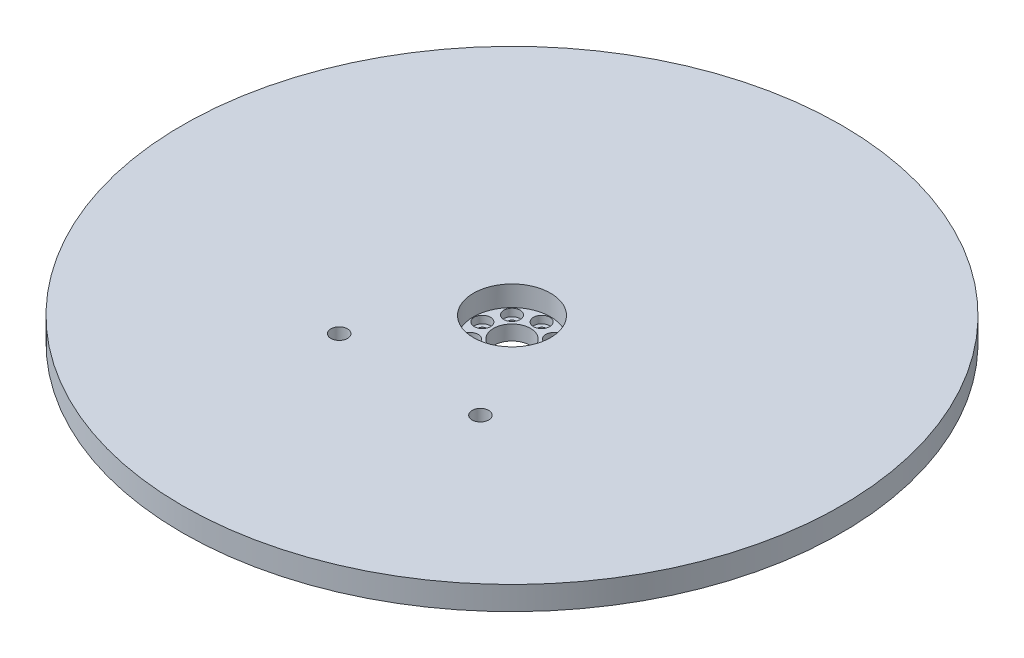
ISO-10303-21;
HEADER;
FILE_DESCRIPTION(('STEP AP214'),'2;1');
FILE_NAME('part.step','',(''),(''),'','','');
FILE_SCHEMA(('AUTOMOTIVE_DESIGN { 1 0 10303 214 1 1 1 1 }'));
ENDSEC;
DATA;
#1=APPLICATION_CONTEXT('core data for automotive mechanical design processes');
#2=APPLICATION_PROTOCOL_DEFINITION('international standard','automotive_design',2000,#1);
#3=PRODUCT_CONTEXT('',#1,'mechanical');
#4=PRODUCT('Part','Part','',(#3));
#5=PRODUCT_RELATED_PRODUCT_CATEGORY('part','',(#4));
#6=PRODUCT_DEFINITION_FORMATION('','',#4);
#7=PRODUCT_DEFINITION_CONTEXT('part definition',#1,'design');
#8=PRODUCT_DEFINITION('design','',#6,#7);
#9=PRODUCT_DEFINITION_SHAPE('','',#8);
#10=(LENGTH_UNIT() NAMED_UNIT(*) SI_UNIT(.MILLI.,.METRE.));
#11=(NAMED_UNIT(*) PLANE_ANGLE_UNIT() SI_UNIT($,.RADIAN.));
#12=(NAMED_UNIT(*) SI_UNIT($,.STERADIAN.) SOLID_ANGLE_UNIT());
#13=UNCERTAINTY_MEASURE_WITH_UNIT(LENGTH_MEASURE(1.E-05),#10,'distance_accuracy_value','');
#14=(GEOMETRIC_REPRESENTATION_CONTEXT(3) GLOBAL_UNCERTAINTY_ASSIGNED_CONTEXT((#13)) GLOBAL_UNIT_ASSIGNED_CONTEXT((#10,
#11,#12)) REPRESENTATION_CONTEXT('',''));
#15=CARTESIAN_POINT('',(0.,0.,0.));
#16=DIRECTION('',(0.,0.,1.));
#17=DIRECTION('',(1.,0.,0.));
#18=AXIS2_PLACEMENT_3D('',#15,#16,#17);
#19=CARTESIAN_POINT('',(0.,-2.35,0.));
#20=DIRECTION('',(0.,-1.,0.));
#21=DIRECTION('',(0.,0.,-1.));
#22=AXIS2_PLACEMENT_3D('',#19,#20,#21);
#23=PLANE('',#22);
#24=CARTESIAN_POINT('',(-5.6568542495,-2.35,-5.6568542495));
#25=DIRECTION('',(0.,1.,0.));
#26=DIRECTION('',(0.,0.,1.));
#27=AXIS2_PLACEMENT_3D('',#24,#25,#26);
#28=CIRCLE('',#27,2.19999999999999);
#29=CARTESIAN_POINT('',(-5.6568542495,-2.35,-3.45685424950001));
#30=VERTEX_POINT('',#29);
#31=EDGE_CURVE('E97',#30,#30,#28,.T.);
#32=ORIENTED_EDGE('',*,*,#31,.F.);
#33=EDGE_LOOP('',(#32));
#34=FACE_BOUND('',#33,.T.);
#35=CARTESIAN_POINT('',(0.,-2.35,-8.));
#36=DIRECTION('',(0.,1.,0.));
#37=DIRECTION('',(0.,0.,1.));
#38=AXIS2_PLACEMENT_3D('',#35,#36,#37);
#39=CIRCLE('',#38,2.19999999999999);
#40=CARTESIAN_POINT('',(0.,-2.35,-5.80000000000001));
#41=VERTEX_POINT('',#40);
#42=EDGE_CURVE('E93',#41,#41,#39,.T.);
#43=ORIENTED_EDGE('',*,*,#42,.F.);
#44=EDGE_LOOP('',(#43));
#45=FACE_BOUND('',#44,.T.);
#46=CARTESIAN_POINT('',(5.6568542495,-2.35,-5.6568542495));
#47=DIRECTION('',(0.,1.,0.));
#48=DIRECTION('',(0.,0.,1.));
#49=AXIS2_PLACEMENT_3D('',#46,#47,#48);
#50=CIRCLE('',#49,2.19999999999999);
#51=CARTESIAN_POINT('',(5.6568542495,-2.35,-3.45685424950001));
#52=VERTEX_POINT('',#51);
#53=EDGE_CURVE('E89',#52,#52,#50,.T.);
#54=ORIENTED_EDGE('',*,*,#53,.F.);
#55=EDGE_LOOP('',(#54));
#56=FACE_BOUND('',#55,.T.);
#57=CARTESIAN_POINT('',(8.,-2.35,0.));
#58=DIRECTION('',(0.,1.,0.));
#59=DIRECTION('',(0.,0.,1.));
#60=AXIS2_PLACEMENT_3D('',#57,#58,#59);
#61=CIRCLE('',#60,2.19999999999999);
#62=CARTESIAN_POINT('',(8.,-2.35,2.19999999999999));
#63=VERTEX_POINT('',#62);
#64=EDGE_CURVE('E84',#63,#63,#61,.T.);
#65=ORIENTED_EDGE('',*,*,#64,.F.);
#66=EDGE_LOOP('',(#65));
#67=FACE_BOUND('',#66,.T.);
#68=CARTESIAN_POINT('',(5.6568542495,-2.35,5.6568542495));
#69=DIRECTION('',(0.,1.,0.));
#70=DIRECTION('',(0.,0.,1.));
#71=AXIS2_PLACEMENT_3D('',#68,#69,#70);
#72=CIRCLE('',#71,2.19999999999999);
#73=CARTESIAN_POINT('',(5.6568542495,-2.35,7.85685424949999));
#74=VERTEX_POINT('',#73);
#75=EDGE_CURVE('E79',#74,#74,#72,.T.);
#76=ORIENTED_EDGE('',*,*,#75,.F.);
#77=EDGE_LOOP('',(#76));
#78=FACE_BOUND('',#77,.T.);
#79=CARTESIAN_POINT('',(-5.6568542495,-2.35,5.6568542495));
#80=DIRECTION('',(0.,1.,0.));
#81=DIRECTION('',(0.,0.,1.));
#82=AXIS2_PLACEMENT_3D('',#79,#80,#81);
#83=CIRCLE('',#82,2.19999999999999);
#84=CARTESIAN_POINT('',(-5.6568542495,-2.35,7.85685424949999));
#85=VERTEX_POINT('',#84);
#86=EDGE_CURVE('E69',#85,#85,#83,.T.);
#87=ORIENTED_EDGE('',*,*,#86,.F.);
#88=EDGE_LOOP('',(#87));
#89=FACE_BOUND('',#88,.T.);
#90=CARTESIAN_POINT('',(-8.,-2.35,0.));
#91=DIRECTION('',(0.,1.,0.));
#92=DIRECTION('',(0.,0.,1.));
#93=AXIS2_PLACEMENT_3D('',#90,#91,#92);
#94=CIRCLE('',#93,2.19999999999999);
#95=CARTESIAN_POINT('',(-8.,-2.35,2.19999999999999));
#96=VERTEX_POINT('',#95);
#97=EDGE_CURVE('E64',#96,#96,#94,.T.);
#98=ORIENTED_EDGE('',*,*,#97,.F.);
#99=EDGE_LOOP('',(#98));
#100=FACE_BOUND('',#99,.T.);
#101=CARTESIAN_POINT('',(0.,-2.35,0.));
#102=DIRECTION('',(0.,1.,0.));
#103=DIRECTION('',(0.,0.,1.));
#104=AXIS2_PLACEMENT_3D('',#101,#102,#103);
#105=CIRCLE('',#104,5.);
#106=CARTESIAN_POINT('',(0.,-2.35,5.));
#107=VERTEX_POINT('',#106);
#108=EDGE_CURVE('E165',#107,#107,#105,.T.);
#109=ORIENTED_EDGE('',*,*,#108,.F.);
#110=EDGE_LOOP('',(#109));
#111=FACE_BOUND('',#110,.T.);
#112=CARTESIAN_POINT('',(0.,-2.35,0.));
#113=DIRECTION('',(0.,-1.,0.));
#114=DIRECTION('',(0.,0.,-1.));
#115=AXIS2_PLACEMENT_3D('',#112,#113,#114);
#116=CIRCLE('',#115,10.4);
#117=CARTESIAN_POINT('',(0.,-2.35,-10.4));
#118=VERTEX_POINT('',#117);
#119=EDGE_CURVE('E173',#118,#118,#116,.F.);
#120=ORIENTED_EDGE('',*,*,#119,.T.);
#121=EDGE_LOOP('',(#120));
#122=FACE_BOUND('',#121,.T.);
#123=CARTESIAN_POINT('',(0.,-2.35,8.));
#124=DIRECTION('',(0.,1.,0.));
#125=DIRECTION('',(0.,0.,1.));
#126=AXIS2_PLACEMENT_3D('',#123,#124,#125);
#127=CIRCLE('',#126,2.19999999999999);
#128=CARTESIAN_POINT('',(0.,-2.35,10.2));
#129=VERTEX_POINT('',#128);
#130=EDGE_CURVE('E74',#129,#129,#127,.T.);
#131=ORIENTED_EDGE('',*,*,#130,.F.);
#132=EDGE_LOOP('',(#131));
#133=FACE_BOUND('',#132,.T.);
#134=ADVANCED_FACE('F39',(#34,#45,#56,#67,#78,#89,#100,#111,#122,#133),#23,.F.);
#135=CARTESIAN_POINT('',(0.,3.175,0.));
#136=DIRECTION('',(0.,-1.,0.));
#137=DIRECTION('',(0.,0.,-1.));
#138=AXIS2_PLACEMENT_3D('',#135,#136,#137);
#139=CYLINDRICAL_SURFACE('',#138,88.9);
#140=CARTESIAN_POINT('',(0.,3.175,0.));
#141=DIRECTION('',(0.,1.,0.));
#142=DIRECTION('',(0.,0.,1.));
#143=AXIS2_PLACEMENT_3D('',#140,#141,#142);
#144=CIRCLE('',#143,88.9);
#145=CARTESIAN_POINT('',(0.,3.175,88.9));
#146=VERTEX_POINT('',#145);
#147=EDGE_CURVE('E47',#146,#146,#144,.T.);
#148=ORIENTED_EDGE('',*,*,#147,.F.);
#149=EDGE_LOOP('',(#148));
#150=FACE_BOUND('',#149,.T.);
#151=CARTESIAN_POINT('',(0.,-3.175,0.));
#152=DIRECTION('',(0.,1.,0.));
#153=DIRECTION('',(0.,0.,1.));
#154=AXIS2_PLACEMENT_3D('',#151,#152,#153);
#155=CIRCLE('',#154,88.9);
#156=CARTESIAN_POINT('',(0.,-3.175,88.9));
#157=VERTEX_POINT('',#156);
#158=EDGE_CURVE('E52',#157,#157,#155,.T.);
#159=ORIENTED_EDGE('',*,*,#158,.T.);
#160=EDGE_LOOP('',(#159));
#161=FACE_BOUND('',#160,.T.);
#162=ADVANCED_FACE('F41',(#150,#161),#139,.T.);
#163=CARTESIAN_POINT('',(0.,3.175,0.));
#164=DIRECTION('',(0.,1.,0.));
#165=DIRECTION('',(0.,0.,1.));
#166=AXIS2_PLACEMENT_3D('',#163,#164,#165);
#167=PLANE('',#166);
#168=CARTESIAN_POINT('',(19.0499999999564,3.175,27.5642423430902));
#169=DIRECTION('',(0.,1.,0.));
#170=DIRECTION('',(0.,0.,1.));
#171=AXIS2_PLACEMENT_3D('',#168,#169,#170);
#172=CIRCLE('',#171,2.24999999999999);
#173=CARTESIAN_POINT('',(19.0499999999564,3.175,29.8142423430901));
#174=VERTEX_POINT('',#173);
#175=EDGE_CURVE('E109',#174,#174,#172,.T.);
#176=ORIENTED_EDGE('',*,*,#175,.F.);
#177=EDGE_LOOP('',(#176));
#178=FACE_BOUND('',#177,.T.);
#179=CARTESIAN_POINT('',(-19.0500000000436,3.175,27.5642423430902));
#180=DIRECTION('',(0.,1.,0.));
#181=DIRECTION('',(0.,0.,1.));
#182=AXIS2_PLACEMENT_3D('',#179,#180,#181);
#183=CIRCLE('',#182,2.24999999999999);
#184=CARTESIAN_POINT('',(-19.0500000000436,3.175,29.8142423430901));
#185=VERTEX_POINT('',#184);
#186=EDGE_CURVE('E98',#185,#185,#183,.T.);
#187=ORIENTED_EDGE('',*,*,#186,.F.);
#188=EDGE_LOOP('',(#187));
#189=FACE_BOUND('',#188,.T.);
#190=CARTESIAN_POINT('',(0.,3.175,0.));
#191=DIRECTION('',(0.,1.,0.));
#192=DIRECTION('',(0.,0.,1.));
#193=AXIS2_PLACEMENT_3D('',#190,#191,#192);
#194=CIRCLE('',#193,10.4);
#195=CARTESIAN_POINT('',(0.,3.175,10.4));
#196=VERTEX_POINT('',#195);
#197=EDGE_CURVE('E168',#196,#196,#194,.T.);
#198=ORIENTED_EDGE('',*,*,#197,.F.);
#199=EDGE_LOOP('',(#198));
#200=FACE_BOUND('',#199,.T.);
#201=ORIENTED_EDGE('',*,*,#147,.T.);
#202=EDGE_LOOP('',(#201));
#203=FACE_BOUND('',#202,.T.);
#204=ADVANCED_FACE('F187',(#178,#189,#200,#203),#167,.T.);
#205=CARTESIAN_POINT('',(0.,-3.175,0.));
#206=DIRECTION('',(0.,1.,0.));
#207=DIRECTION('',(0.,0.,1.));
#208=AXIS2_PLACEMENT_3D('',#205,#206,#207);
#209=PLANE('',#208);
#210=CARTESIAN_POINT('',(19.0499999999564,-3.175,27.5642423430902));
#211=DIRECTION('',(0.,1.,0.));
#212=DIRECTION('',(0.,0.,1.));
#213=AXIS2_PLACEMENT_3D('',#210,#211,#212);
#214=CIRCLE('',#213,2.24999999999999);
#215=CARTESIAN_POINT('',(19.0499999999564,-3.175,29.8142423430901));
#216=VERTEX_POINT('',#215);
#217=EDGE_CURVE('E43',#216,#216,#214,.T.);
#218=ORIENTED_EDGE('',*,*,#217,.T.);
#219=EDGE_LOOP('',(#218));
#220=FACE_BOUND('',#219,.T.);
#221=CARTESIAN_POINT('',(-19.0500000000436,-3.175,27.5642423430902));
#222=DIRECTION('',(0.,1.,0.));
#223=DIRECTION('',(0.,0.,1.));
#224=AXIS2_PLACEMENT_3D('',#221,#222,#223);
#225=CIRCLE('',#224,2.24999999999999);
#226=CARTESIAN_POINT('',(-19.0500000000436,-3.175,29.8142423430901));
#227=VERTEX_POINT('',#226);
#228=EDGE_CURVE('E95',#227,#227,#225,.T.);
#229=ORIENTED_EDGE('',*,*,#228,.T.);
#230=EDGE_LOOP('',(#229));
#231=FACE_BOUND('',#230,.T.);
#232=CARTESIAN_POINT('',(0.,-3.175,0.));
#233=DIRECTION('',(0.,1.,0.));
#234=DIRECTION('',(0.,0.,1.));
#235=AXIS2_PLACEMENT_3D('',#232,#233,#234);
#236=CIRCLE('',#235,12.065);
#237=CARTESIAN_POINT('',(0.,-3.175,12.065));
#238=VERTEX_POINT('',#237);
#239=EDGE_CURVE('E11',#238,#238,#236,.F.);
#240=ORIENTED_EDGE('',*,*,#239,.F.);
#241=EDGE_LOOP('',(#240));
#242=FACE_BOUND('',#241,.T.);
#243=ORIENTED_EDGE('',*,*,#158,.F.);
#244=EDGE_LOOP('',(#243));
#245=FACE_BOUND('',#244,.T.);
#246=ADVANCED_FACE('F184',(#220,#231,#242,#245),#209,.F.);
#247=CARTESIAN_POINT('',(0.,-6.35,0.));
#248=DIRECTION('',(0.,1.,0.));
#249=DIRECTION('',(0.,0.,1.));
#250=AXIS2_PLACEMENT_3D('',#247,#248,#249);
#251=CYLINDRICAL_SURFACE('',#250,12.065);
#252=CARTESIAN_POINT('',(0.,-6.35,0.));
#253=DIRECTION('',(0.,-1.,0.));
#254=DIRECTION('',(0.,0.,-1.));
#255=AXIS2_PLACEMENT_3D('',#252,#253,#254);
#256=CIRCLE('',#255,12.065);
#257=CARTESIAN_POINT('',(0.,-6.35,-12.065));
#258=VERTEX_POINT('',#257);
#259=EDGE_CURVE('E176',#258,#258,#256,.T.);
#260=ORIENTED_EDGE('',*,*,#259,.F.);
#261=EDGE_LOOP('',(#260));
#262=FACE_BOUND('',#261,.T.);
#263=ORIENTED_EDGE('',*,*,#239,.T.);
#264=EDGE_LOOP('',(#263));
#265=FACE_BOUND('',#264,.T.);
#266=ADVANCED_FACE('F186',(#262,#265),#251,.T.);
#267=CARTESIAN_POINT('',(0.,-6.35,0.));
#268=DIRECTION('',(0.,-1.,0.));
#269=DIRECTION('',(0.,0.,-1.));
#270=AXIS2_PLACEMENT_3D('',#267,#268,#269);
#271=PLANE('',#270);
#272=CARTESIAN_POINT('',(-5.6568542495,-6.35,-5.6568542495));
#273=DIRECTION('',(0.,-1.,0.));
#274=DIRECTION('',(0.,0.,-1.));
#275=AXIS2_PLACEMENT_3D('',#272,#273,#274);
#276=CIRCLE('',#275,1.1);
#277=CARTESIAN_POINT('',(-5.6568542495,-6.35,-6.7568542495));
#278=VERTEX_POINT('',#277);
#279=EDGE_CURVE('E91',#278,#278,#276,.T.);
#280=ORIENTED_EDGE('',*,*,#279,.F.);
#281=EDGE_LOOP('',(#280));
#282=FACE_BOUND('',#281,.T.);
#283=CARTESIAN_POINT('',(0.,-6.35,-8.));
#284=DIRECTION('',(0.,-1.,0.));
#285=DIRECTION('',(0.,0.,-1.));
#286=AXIS2_PLACEMENT_3D('',#283,#284,#285);
#287=CIRCLE('',#286,1.1);
#288=CARTESIAN_POINT('',(0.,-6.35,-9.1));
#289=VERTEX_POINT('',#288);
#290=EDGE_CURVE('E86',#289,#289,#287,.T.);
#291=ORIENTED_EDGE('',*,*,#290,.F.);
#292=EDGE_LOOP('',(#291));
#293=FACE_BOUND('',#292,.T.);
#294=CARTESIAN_POINT('',(5.6568542495,-6.35,-5.6568542495));
#295=DIRECTION('',(0.,-1.,0.));
#296=DIRECTION('',(0.,0.,-1.));
#297=AXIS2_PLACEMENT_3D('',#294,#295,#296);
#298=CIRCLE('',#297,1.1);
#299=CARTESIAN_POINT('',(5.6568542495,-6.35,-6.7568542495));
#300=VERTEX_POINT('',#299);
#301=EDGE_CURVE('E81',#300,#300,#298,.T.);
#302=ORIENTED_EDGE('',*,*,#301,.F.);
#303=EDGE_LOOP('',(#302));
#304=FACE_BOUND('',#303,.T.);
#305=CARTESIAN_POINT('',(8.,-6.35,0.));
#306=DIRECTION('',(0.,-1.,0.));
#307=DIRECTION('',(0.,0.,-1.));
#308=AXIS2_PLACEMENT_3D('',#305,#306,#307);
#309=CIRCLE('',#308,1.1);
#310=CARTESIAN_POINT('',(8.,-6.35,-1.1));
#311=VERTEX_POINT('',#310);
#312=EDGE_CURVE('E76',#311,#311,#309,.T.);
#313=ORIENTED_EDGE('',*,*,#312,.F.);
#314=EDGE_LOOP('',(#313));
#315=FACE_BOUND('',#314,.T.);
#316=CARTESIAN_POINT('',(5.6568542495,-6.35,5.6568542495));
#317=DIRECTION('',(0.,-1.,0.));
#318=DIRECTION('',(0.,0.,-1.));
#319=AXIS2_PLACEMENT_3D('',#316,#317,#318);
#320=CIRCLE('',#319,1.1);
#321=CARTESIAN_POINT('',(5.6568542495,-6.35,4.5568542495));
#322=VERTEX_POINT('',#321);
#323=EDGE_CURVE('E71',#322,#322,#320,.T.);
#324=ORIENTED_EDGE('',*,*,#323,.F.);
#325=EDGE_LOOP('',(#324));
#326=FACE_BOUND('',#325,.T.);
#327=CARTESIAN_POINT('',(0.,-6.35,8.));
#328=DIRECTION('',(0.,-1.,0.));
#329=DIRECTION('',(0.,0.,-1.));
#330=AXIS2_PLACEMENT_3D('',#327,#328,#329);
#331=CIRCLE('',#330,1.1);
#332=CARTESIAN_POINT('',(0.,-6.35,6.9));
#333=VERTEX_POINT('',#332);
#334=EDGE_CURVE('E66',#333,#333,#331,.T.);
#335=ORIENTED_EDGE('',*,*,#334,.F.);
#336=EDGE_LOOP('',(#335));
#337=FACE_BOUND('',#336,.T.);
#338=CARTESIAN_POINT('',(-5.6568542495,-6.35,5.6568542495));
#339=DIRECTION('',(0.,-1.,0.));
#340=DIRECTION('',(0.,0.,-1.));
#341=AXIS2_PLACEMENT_3D('',#338,#339,#340);
#342=CIRCLE('',#341,1.1);
#343=CARTESIAN_POINT('',(-5.6568542495,-6.35,4.5568542495));
#344=VERTEX_POINT('',#343);
#345=EDGE_CURVE('E61',#344,#344,#342,.T.);
#346=ORIENTED_EDGE('',*,*,#345,.F.);
#347=EDGE_LOOP('',(#346));
#348=FACE_BOUND('',#347,.T.);
#349=CARTESIAN_POINT('',(-8.,-6.35,0.));
#350=DIRECTION('',(0.,-1.,0.));
#351=DIRECTION('',(0.,0.,-1.));
#352=AXIS2_PLACEMENT_3D('',#349,#350,#351);
#353=CIRCLE('',#352,1.1);
#354=CARTESIAN_POINT('',(-8.,-6.35,-1.1));
#355=VERTEX_POINT('',#354);
#356=EDGE_CURVE('E56',#355,#355,#353,.T.);
#357=ORIENTED_EDGE('',*,*,#356,.F.);
#358=EDGE_LOOP('',(#357));
#359=FACE_BOUND('',#358,.T.);
#360=CARTESIAN_POINT('',(0.,-6.35,0.));
#361=DIRECTION('',(0.,-1.,0.));
#362=DIRECTION('',(0.,0.,-1.));
#363=AXIS2_PLACEMENT_3D('',#360,#361,#362);
#364=CIRCLE('',#363,5.);
#365=CARTESIAN_POINT('',(0.,-6.35,-5.));
#366=VERTEX_POINT('',#365);
#367=EDGE_CURVE('E59',#366,#366,#364,.F.);
#368=ORIENTED_EDGE('',*,*,#367,.T.);
#369=EDGE_LOOP('',(#368));
#370=FACE_BOUND('',#369,.T.);
#371=ORIENTED_EDGE('',*,*,#259,.T.);
#372=EDGE_LOOP('',(#371));
#373=FACE_BOUND('',#372,.T.);
#374=ADVANCED_FACE('F193',(#282,#293,#304,#315,#326,#337,#348,#359,#370,#373),#271,.T.);
#375=CARTESIAN_POINT('',(0.,-35.7656420973604,0.));
#376=DIRECTION('',(0.,1.,0.));
#377=DIRECTION('',(0.,0.,1.));
#378=AXIS2_PLACEMENT_3D('',#375,#376,#377);
#379=CYLINDRICAL_SURFACE('',#378,10.4);
#380=ORIENTED_EDGE('',*,*,#197,.T.);
#381=EDGE_LOOP('',(#380));
#382=FACE_BOUND('',#381,.T.);
#383=ORIENTED_EDGE('',*,*,#119,.F.);
#384=EDGE_LOOP('',(#383));
#385=FACE_BOUND('',#384,.T.);
#386=ADVANCED_FACE('F209',(#382,#385),#379,.F.);
#387=CARTESIAN_POINT('',(0.,-6.351,0.));
#388=DIRECTION('',(0.,1.,0.));
#389=DIRECTION('',(0.,0.,1.));
#390=AXIS2_PLACEMENT_3D('',#387,#388,#389);
#391=CYLINDRICAL_SURFACE('',#390,5.);
#392=ORIENTED_EDGE('',*,*,#367,.F.);
#393=EDGE_LOOP('',(#392));
#394=FACE_BOUND('',#393,.T.);
#395=ORIENTED_EDGE('',*,*,#108,.T.);
#396=EDGE_LOOP('',(#395));
#397=FACE_BOUND('',#396,.T.);
#398=ADVANCED_FACE('F216',(#394,#397),#391,.F.);
#399=CARTESIAN_POINT('',(-8.,-2.35,0.));
#400=DIRECTION('',(0.,1.,0.));
#401=DIRECTION('',(0.,0.,1.));
#402=AXIS2_PLACEMENT_3D('',#399,#400,#401);
#403=CYLINDRICAL_SURFACE('',#402,1.1);
#404=ORIENTED_EDGE('',*,*,#356,.T.);
#405=EDGE_LOOP('',(#404));
#406=FACE_BOUND('',#405,.T.);
#407=CARTESIAN_POINT('',(-8.,-4.35,0.));
#408=DIRECTION('',(0.,1.,0.));
#409=DIRECTION('',(0.,0.,1.));
#410=AXIS2_PLACEMENT_3D('',#407,#408,#409);
#411=CIRCLE('',#410,1.1);
#412=CARTESIAN_POINT('',(-8.,-4.35,1.1));
#413=VERTEX_POINT('',#412);
#414=EDGE_CURVE('E60',#413,#413,#411,.T.);
#415=ORIENTED_EDGE('',*,*,#414,.T.);
#416=EDGE_LOOP('',(#415));
#417=FACE_BOUND('',#416,.T.);
#418=ADVANCED_FACE('F238',(#406,#417),#403,.F.);
#419=CARTESIAN_POINT('',(-6.9,-4.35,0.));
#420=DIRECTION('',(0.,-1.,0.));
#421=DIRECTION('',(0.,0.,-1.));
#422=AXIS2_PLACEMENT_3D('',#419,#420,#421);
#423=PLANE('',#422);
#424=ORIENTED_EDGE('',*,*,#414,.F.);
#425=EDGE_LOOP('',(#424));
#426=FACE_BOUND('',#425,.T.);
#427=CARTESIAN_POINT('',(-8.,-4.35,0.));
#428=DIRECTION('',(0.,1.,0.));
#429=DIRECTION('',(0.,0.,1.));
#430=AXIS2_PLACEMENT_3D('',#427,#428,#429);
#431=CIRCLE('',#430,2.2);
#432=CARTESIAN_POINT('',(-8.,-4.35,2.2));
#433=VERTEX_POINT('',#432);
#434=EDGE_CURVE('E160',#433,#433,#431,.T.);
#435=ORIENTED_EDGE('',*,*,#434,.T.);
#436=EDGE_LOOP('',(#435));
#437=FACE_BOUND('',#436,.T.);
#438=ADVANCED_FACE('F283',(#426,#437),#423,.F.);
#439=CARTESIAN_POINT('',(-8.,-2.35,0.));
#440=DIRECTION('',(0.,1.,0.));
#441=DIRECTION('',(0.,0.,1.));
#442=AXIS2_PLACEMENT_3D('',#439,#440,#441);
#443=CYLINDRICAL_SURFACE('',#442,2.19999999999999);
#444=ORIENTED_EDGE('',*,*,#434,.F.);
#445=EDGE_LOOP('',(#444));
#446=FACE_BOUND('',#445,.T.);
#447=ORIENTED_EDGE('',*,*,#97,.T.);
#448=EDGE_LOOP('',(#447));
#449=FACE_BOUND('',#448,.T.);
#450=ADVANCED_FACE('F279',(#446,#449),#443,.F.);
#451=CARTESIAN_POINT('',(-5.6568542495,-2.35,5.6568542495));
#452=DIRECTION('',(0.,1.,0.));
#453=DIRECTION('',(0.,0.,1.));
#454=AXIS2_PLACEMENT_3D('',#451,#452,#453);
#455=CYLINDRICAL_SURFACE('',#454,1.1);
#456=ORIENTED_EDGE('',*,*,#345,.T.);
#457=EDGE_LOOP('',(#456));
#458=FACE_BOUND('',#457,.T.);
#459=CARTESIAN_POINT('',(-5.6568542495,-4.35,5.6568542495));
#460=DIRECTION('',(0.,1.,0.));
#461=DIRECTION('',(0.,0.,1.));
#462=AXIS2_PLACEMENT_3D('',#459,#460,#461);
#463=CIRCLE('',#462,1.1);
#464=CARTESIAN_POINT('',(-5.6568542495,-4.35,6.7568542495));
#465=VERTEX_POINT('',#464);
#466=EDGE_CURVE('E65',#465,#465,#463,.T.);
#467=ORIENTED_EDGE('',*,*,#466,.T.);
#468=EDGE_LOOP('',(#467));
#469=FACE_BOUND('',#468,.T.);
#470=ADVANCED_FACE('F275',(#458,#469),#455,.F.);
#471=CARTESIAN_POINT('',(-4.5568542495,-4.35,5.6568542495));
#472=DIRECTION('',(0.,-1.,0.));
#473=DIRECTION('',(0.,0.,-1.));
#474=AXIS2_PLACEMENT_3D('',#471,#472,#473);
#475=PLANE('',#474);
#476=ORIENTED_EDGE('',*,*,#466,.F.);
#477=EDGE_LOOP('',(#476));
#478=FACE_BOUND('',#477,.T.);
#479=CARTESIAN_POINT('',(-5.6568542495,-4.35,5.6568542495));
#480=DIRECTION('',(0.,1.,0.));
#481=DIRECTION('',(0.,0.,1.));
#482=AXIS2_PLACEMENT_3D('',#479,#480,#481);
#483=CIRCLE('',#482,2.2);
#484=CARTESIAN_POINT('',(-5.6568542495,-4.35,7.8568542495));
#485=VERTEX_POINT('',#484);
#486=EDGE_CURVE('E153',#485,#485,#483,.T.);
#487=ORIENTED_EDGE('',*,*,#486,.T.);
#488=EDGE_LOOP('',(#487));
#489=FACE_BOUND('',#488,.T.);
#490=ADVANCED_FACE('F271',(#478,#489),#475,.F.);
#491=CARTESIAN_POINT('',(-5.6568542495,-2.35,5.6568542495));
#492=DIRECTION('',(0.,1.,0.));
#493=DIRECTION('',(0.,0.,1.));
#494=AXIS2_PLACEMENT_3D('',#491,#492,#493);
#495=CYLINDRICAL_SURFACE('',#494,2.19999999999999);
#496=ORIENTED_EDGE('',*,*,#486,.F.);
#497=EDGE_LOOP('',(#496));
#498=FACE_BOUND('',#497,.T.);
#499=ORIENTED_EDGE('',*,*,#86,.T.);
#500=EDGE_LOOP('',(#499));
#501=FACE_BOUND('',#500,.T.);
#502=ADVANCED_FACE('F267',(#498,#501),#495,.F.);
#503=CARTESIAN_POINT('',(0.,-2.35,8.));
#504=DIRECTION('',(0.,1.,0.));
#505=DIRECTION('',(0.,0.,1.));
#506=AXIS2_PLACEMENT_3D('',#503,#504,#505);
#507=CYLINDRICAL_SURFACE('',#506,1.1);
#508=ORIENTED_EDGE('',*,*,#334,.T.);
#509=EDGE_LOOP('',(#508));
#510=FACE_BOUND('',#509,.T.);
#511=CARTESIAN_POINT('',(0.,-4.35,8.));
#512=DIRECTION('',(0.,1.,0.));
#513=DIRECTION('',(0.,0.,1.));
#514=AXIS2_PLACEMENT_3D('',#511,#512,#513);
#515=CIRCLE('',#514,1.1);
#516=CARTESIAN_POINT('',(0.,-4.35,9.1));
#517=VERTEX_POINT('',#516);
#518=EDGE_CURVE('E70',#517,#517,#515,.T.);
#519=ORIENTED_EDGE('',*,*,#518,.T.);
#520=EDGE_LOOP('',(#519));
#521=FACE_BOUND('',#520,.T.);
#522=ADVANCED_FACE('F259',(#510,#521),#507,.F.);
#523=CARTESIAN_POINT('',(1.1,-4.35,8.));
#524=DIRECTION('',(0.,-1.,0.));
#525=DIRECTION('',(0.,0.,-1.));
#526=AXIS2_PLACEMENT_3D('',#523,#524,#525);
#527=PLANE('',#526);
#528=ORIENTED_EDGE('',*,*,#518,.F.);
#529=EDGE_LOOP('',(#528));
#530=FACE_BOUND('',#529,.T.);
#531=CARTESIAN_POINT('',(0.,-4.35,8.));
#532=DIRECTION('',(0.,1.,0.));
#533=DIRECTION('',(0.,0.,1.));
#534=AXIS2_PLACEMENT_3D('',#531,#532,#533);
#535=CIRCLE('',#534,2.2);
#536=CARTESIAN_POINT('',(0.,-4.35,10.2));
#537=VERTEX_POINT('',#536);
#538=EDGE_CURVE('E146',#537,#537,#535,.T.);
#539=ORIENTED_EDGE('',*,*,#538,.T.);
#540=EDGE_LOOP('',(#539));
#541=FACE_BOUND('',#540,.T.);
#542=ADVANCED_FACE('F249',(#530,#541),#527,.F.);
#543=CARTESIAN_POINT('',(0.,-2.35,8.));
#544=DIRECTION('',(0.,1.,0.));
#545=DIRECTION('',(0.,0.,1.));
#546=AXIS2_PLACEMENT_3D('',#543,#544,#545);
#547=CYLINDRICAL_SURFACE('',#546,2.19999999999999);
#548=ORIENTED_EDGE('',*,*,#538,.F.);
#549=EDGE_LOOP('',(#548));
#550=FACE_BOUND('',#549,.T.);
#551=ORIENTED_EDGE('',*,*,#130,.T.);
#552=EDGE_LOOP('',(#551));
#553=FACE_BOUND('',#552,.T.);
#554=ADVANCED_FACE('F246',(#550,#553),#547,.F.);
#555=CARTESIAN_POINT('',(5.6568542495,-2.35,5.6568542495));
#556=DIRECTION('',(0.,1.,0.));
#557=DIRECTION('',(0.,0.,1.));
#558=AXIS2_PLACEMENT_3D('',#555,#556,#557);
#559=CYLINDRICAL_SURFACE('',#558,1.1);
#560=ORIENTED_EDGE('',*,*,#323,.T.);
#561=EDGE_LOOP('',(#560));
#562=FACE_BOUND('',#561,.T.);
#563=CARTESIAN_POINT('',(5.6568542495,-4.35,5.6568542495));
#564=DIRECTION('',(0.,1.,0.));
#565=DIRECTION('',(0.,0.,1.));
#566=AXIS2_PLACEMENT_3D('',#563,#564,#565);
#567=CIRCLE('',#566,1.1);
#568=CARTESIAN_POINT('',(5.6568542495,-4.35,6.7568542495));
#569=VERTEX_POINT('',#568);
#570=EDGE_CURVE('E75',#569,#569,#567,.T.);
#571=ORIENTED_EDGE('',*,*,#570,.T.);
#572=EDGE_LOOP('',(#571));
#573=FACE_BOUND('',#572,.T.);
#574=ADVANCED_FACE('F248',(#562,#573),#559,.F.);
#575=CARTESIAN_POINT('',(6.7568542495,-4.35,5.6568542495));
#576=DIRECTION('',(0.,-1.,0.));
#577=DIRECTION('',(0.,0.,-1.));
#578=AXIS2_PLACEMENT_3D('',#575,#576,#577);
#579=PLANE('',#578);
#580=ORIENTED_EDGE('',*,*,#570,.F.);
#581=EDGE_LOOP('',(#580));
#582=FACE_BOUND('',#581,.T.);
#583=CARTESIAN_POINT('',(5.6568542495,-4.35,5.6568542495));
#584=DIRECTION('',(0.,1.,0.));
#585=DIRECTION('',(0.,0.,1.));
#586=AXIS2_PLACEMENT_3D('',#583,#584,#585);
#587=CIRCLE('',#586,2.2);
#588=CARTESIAN_POINT('',(5.6568542495,-4.35,7.8568542495));
#589=VERTEX_POINT('',#588);
#590=EDGE_CURVE('E139',#589,#589,#587,.T.);
#591=ORIENTED_EDGE('',*,*,#590,.T.);
#592=EDGE_LOOP('',(#591));
#593=FACE_BOUND('',#592,.T.);
#594=ADVANCED_FACE('F256',(#582,#593),#579,.F.);
#595=CARTESIAN_POINT('',(5.6568542495,-2.35,5.6568542495));
#596=DIRECTION('',(0.,1.,0.));
#597=DIRECTION('',(0.,0.,1.));
#598=AXIS2_PLACEMENT_3D('',#595,#596,#597);
#599=CYLINDRICAL_SURFACE('',#598,2.19999999999999);
#600=ORIENTED_EDGE('',*,*,#590,.F.);
#601=EDGE_LOOP('',(#600));
#602=FACE_BOUND('',#601,.T.);
#603=ORIENTED_EDGE('',*,*,#75,.T.);
#604=EDGE_LOOP('',(#603));
#605=FACE_BOUND('',#604,.T.);
#606=ADVANCED_FACE('F351',(#602,#605),#599,.F.);
#607=CARTESIAN_POINT('',(8.,-2.35,0.));
#608=DIRECTION('',(0.,1.,0.));
#609=DIRECTION('',(0.,0.,1.));
#610=AXIS2_PLACEMENT_3D('',#607,#608,#609);
#611=CYLINDRICAL_SURFACE('',#610,1.1);
#612=ORIENTED_EDGE('',*,*,#312,.T.);
#613=EDGE_LOOP('',(#612));
#614=FACE_BOUND('',#613,.T.);
#615=CARTESIAN_POINT('',(8.,-4.35,0.));
#616=DIRECTION('',(0.,1.,0.));
#617=DIRECTION('',(0.,0.,1.));
#618=AXIS2_PLACEMENT_3D('',#615,#616,#617);
#619=CIRCLE('',#618,1.1);
#620=CARTESIAN_POINT('',(8.,-4.35,1.1));
#621=VERTEX_POINT('',#620);
#622=EDGE_CURVE('E80',#621,#621,#619,.T.);
#623=ORIENTED_EDGE('',*,*,#622,.T.);
#624=EDGE_LOOP('',(#623));
#625=FACE_BOUND('',#624,.T.);
#626=ADVANCED_FACE('F361',(#614,#625),#611,.F.);
#627=CARTESIAN_POINT('',(9.1,-4.35,0.));
#628=DIRECTION('',(0.,-1.,0.));
#629=DIRECTION('',(0.,0.,-1.));
#630=AXIS2_PLACEMENT_3D('',#627,#628,#629);
#631=PLANE('',#630);
#632=ORIENTED_EDGE('',*,*,#622,.F.);
#633=EDGE_LOOP('',(#632));
#634=FACE_BOUND('',#633,.T.);
#635=CARTESIAN_POINT('',(8.,-4.35,0.));
#636=DIRECTION('',(0.,1.,0.));
#637=DIRECTION('',(0.,0.,1.));
#638=AXIS2_PLACEMENT_3D('',#635,#636,#637);
#639=CIRCLE('',#638,2.2);
#640=CARTESIAN_POINT('',(8.,-4.35,2.2));
#641=VERTEX_POINT('',#640);
#642=EDGE_CURVE('E132',#641,#641,#639,.T.);
#643=ORIENTED_EDGE('',*,*,#642,.T.);
#644=EDGE_LOOP('',(#643));
#645=FACE_BOUND('',#644,.T.);
#646=ADVANCED_FACE('F372',(#634,#645),#631,.F.);
#647=CARTESIAN_POINT('',(8.,-2.35,0.));
#648=DIRECTION('',(0.,1.,0.));
#649=DIRECTION('',(0.,0.,1.));
#650=AXIS2_PLACEMENT_3D('',#647,#648,#649);
#651=CYLINDRICAL_SURFACE('',#650,2.2);
#652=ORIENTED_EDGE('',*,*,#642,.F.);
#653=EDGE_LOOP('',(#652));
#654=FACE_BOUND('',#653,.T.);
#655=ORIENTED_EDGE('',*,*,#64,.T.);
#656=EDGE_LOOP('',(#655));
#657=FACE_BOUND('',#656,.T.);
#658=ADVANCED_FACE('F383',(#654,#657),#651,.F.);
#659=CARTESIAN_POINT('',(5.6568542495,-2.35,-5.6568542495));
#660=DIRECTION('',(0.,1.,0.));
#661=DIRECTION('',(0.,0.,1.));
#662=AXIS2_PLACEMENT_3D('',#659,#660,#661);
#663=CYLINDRICAL_SURFACE('',#662,1.1);
#664=ORIENTED_EDGE('',*,*,#301,.T.);
#665=EDGE_LOOP('',(#664));
#666=FACE_BOUND('',#665,.T.);
#667=CARTESIAN_POINT('',(5.6568542495,-4.35,-5.6568542495));
#668=DIRECTION('',(0.,1.,0.));
#669=DIRECTION('',(0.,0.,1.));
#670=AXIS2_PLACEMENT_3D('',#667,#668,#669);
#671=CIRCLE('',#670,1.1);
#672=CARTESIAN_POINT('',(5.6568542495,-4.35,-4.5568542495));
#673=VERTEX_POINT('',#672);
#674=EDGE_CURVE('E85',#673,#673,#671,.T.);
#675=ORIENTED_EDGE('',*,*,#674,.T.);
#676=EDGE_LOOP('',(#675));
#677=FACE_BOUND('',#676,.T.);
#678=ADVANCED_FACE('F394',(#666,#677),#663,.F.);
#679=CARTESIAN_POINT('',(6.7568542495,-4.35,-5.6568542495));
#680=DIRECTION('',(0.,-1.,0.));
#681=DIRECTION('',(0.,0.,-1.));
#682=AXIS2_PLACEMENT_3D('',#679,#680,#681);
#683=PLANE('',#682);
#684=ORIENTED_EDGE('',*,*,#674,.F.);
#685=EDGE_LOOP('',(#684));
#686=FACE_BOUND('',#685,.T.);
#687=CARTESIAN_POINT('',(5.6568542495,-4.35,-5.6568542495));
#688=DIRECTION('',(0.,1.,0.));
#689=DIRECTION('',(0.,0.,1.));
#690=AXIS2_PLACEMENT_3D('',#687,#688,#689);
#691=CIRCLE('',#690,2.2);
#692=CARTESIAN_POINT('',(5.6568542495,-4.35,-3.4568542495));
#693=VERTEX_POINT('',#692);
#694=EDGE_CURVE('E125',#693,#693,#691,.T.);
#695=ORIENTED_EDGE('',*,*,#694,.T.);
#696=EDGE_LOOP('',(#695));
#697=FACE_BOUND('',#696,.T.);
#698=ADVANCED_FACE('F405',(#686,#697),#683,.F.);
#699=CARTESIAN_POINT('',(5.6568542495,-2.35,-5.6568542495));
#700=DIRECTION('',(0.,1.,0.));
#701=DIRECTION('',(0.,0.,1.));
#702=AXIS2_PLACEMENT_3D('',#699,#700,#701);
#703=CYLINDRICAL_SURFACE('',#702,2.19999999999999);
#704=ORIENTED_EDGE('',*,*,#694,.F.);
#705=EDGE_LOOP('',(#704));
#706=FACE_BOUND('',#705,.T.);
#707=ORIENTED_EDGE('',*,*,#53,.T.);
#708=EDGE_LOOP('',(#707));
#709=FACE_BOUND('',#708,.T.);
#710=ADVANCED_FACE('F416',(#706,#709),#703,.F.);
#711=CARTESIAN_POINT('',(0.,-2.35,-8.));
#712=DIRECTION('',(0.,1.,0.));
#713=DIRECTION('',(0.,0.,1.));
#714=AXIS2_PLACEMENT_3D('',#711,#712,#713);
#715=CYLINDRICAL_SURFACE('',#714,1.1);
#716=ORIENTED_EDGE('',*,*,#290,.T.);
#717=EDGE_LOOP('',(#716));
#718=FACE_BOUND('',#717,.T.);
#719=CARTESIAN_POINT('',(0.,-4.35,-8.));
#720=DIRECTION('',(0.,1.,0.));
#721=DIRECTION('',(0.,0.,1.));
#722=AXIS2_PLACEMENT_3D('',#719,#720,#721);
#723=CIRCLE('',#722,1.1);
#724=CARTESIAN_POINT('',(0.,-4.35,-6.9));
#725=VERTEX_POINT('',#724);
#726=EDGE_CURVE('E90',#725,#725,#723,.T.);
#727=ORIENTED_EDGE('',*,*,#726,.T.);
#728=EDGE_LOOP('',(#727));
#729=FACE_BOUND('',#728,.T.);
#730=ADVANCED_FACE('F427',(#718,#729),#715,.F.);
#731=CARTESIAN_POINT('',(1.1,-4.35,-8.));
#732=DIRECTION('',(0.,-1.,0.));
#733=DIRECTION('',(0.,0.,-1.));
#734=AXIS2_PLACEMENT_3D('',#731,#732,#733);
#735=PLANE('',#734);
#736=ORIENTED_EDGE('',*,*,#726,.F.);
#737=EDGE_LOOP('',(#736));
#738=FACE_BOUND('',#737,.T.);
#739=CARTESIAN_POINT('',(0.,-4.35,-8.));
#740=DIRECTION('',(0.,1.,0.));
#741=DIRECTION('',(0.,0.,1.));
#742=AXIS2_PLACEMENT_3D('',#739,#740,#741);
#743=CIRCLE('',#742,2.2);
#744=CARTESIAN_POINT('',(0.,-4.35,-5.8));
#745=VERTEX_POINT('',#744);
#746=EDGE_CURVE('E118',#745,#745,#743,.T.);
#747=ORIENTED_EDGE('',*,*,#746,.T.);
#748=EDGE_LOOP('',(#747));
#749=FACE_BOUND('',#748,.T.);
#750=ADVANCED_FACE('F438',(#738,#749),#735,.F.);
#751=CARTESIAN_POINT('',(0.,-2.35,-8.));
#752=DIRECTION('',(0.,1.,0.));
#753=DIRECTION('',(0.,0.,1.));
#754=AXIS2_PLACEMENT_3D('',#751,#752,#753);
#755=CYLINDRICAL_SURFACE('',#754,2.19999999999999);
#756=ORIENTED_EDGE('',*,*,#746,.F.);
#757=EDGE_LOOP('',(#756));
#758=FACE_BOUND('',#757,.T.);
#759=ORIENTED_EDGE('',*,*,#42,.T.);
#760=EDGE_LOOP('',(#759));
#761=FACE_BOUND('',#760,.T.);
#762=ADVANCED_FACE('F449',(#758,#761),#755,.F.);
#763=CARTESIAN_POINT('',(-5.6568542495,-2.35,-5.6568542495));
#764=DIRECTION('',(0.,1.,0.));
#765=DIRECTION('',(0.,0.,1.));
#766=AXIS2_PLACEMENT_3D('',#763,#764,#765);
#767=CYLINDRICAL_SURFACE('',#766,1.1);
#768=ORIENTED_EDGE('',*,*,#279,.T.);
#769=EDGE_LOOP('',(#768));
#770=FACE_BOUND('',#769,.T.);
#771=CARTESIAN_POINT('',(-5.6568542495,-4.35,-5.6568542495));
#772=DIRECTION('',(0.,1.,0.));
#773=DIRECTION('',(0.,0.,1.));
#774=AXIS2_PLACEMENT_3D('',#771,#772,#773);
#775=CIRCLE('',#774,1.1);
#776=CARTESIAN_POINT('',(-5.6568542495,-4.35,-4.5568542495));
#777=VERTEX_POINT('',#776);
#778=EDGE_CURVE('E94',#777,#777,#775,.T.);
#779=ORIENTED_EDGE('',*,*,#778,.T.);
#780=EDGE_LOOP('',(#779));
#781=FACE_BOUND('',#780,.T.);
#782=ADVANCED_FACE('F460',(#770,#781),#767,.F.);
#783=CARTESIAN_POINT('',(-4.5568542495,-4.35,-5.6568542495));
#784=DIRECTION('',(0.,-1.,0.));
#785=DIRECTION('',(0.,0.,-1.));
#786=AXIS2_PLACEMENT_3D('',#783,#784,#785);
#787=PLANE('',#786);
#788=ORIENTED_EDGE('',*,*,#778,.F.);
#789=EDGE_LOOP('',(#788));
#790=FACE_BOUND('',#789,.T.);
#791=CARTESIAN_POINT('',(-5.6568542495,-4.35,-5.6568542495));
#792=DIRECTION('',(0.,1.,0.));
#793=DIRECTION('',(0.,0.,1.));
#794=AXIS2_PLACEMENT_3D('',#791,#792,#793);
#795=CIRCLE('',#794,2.2);
#796=CARTESIAN_POINT('',(-5.6568542495,-4.35,-3.4568542495));
#797=VERTEX_POINT('',#796);
#798=EDGE_CURVE('E102',#797,#797,#795,.T.);
#799=ORIENTED_EDGE('',*,*,#798,.T.);
#800=EDGE_LOOP('',(#799));
#801=FACE_BOUND('',#800,.T.);
#802=ADVANCED_FACE('F471',(#790,#801),#787,.F.);
#803=CARTESIAN_POINT('',(-5.6568542495,-2.35,-5.6568542495));
#804=DIRECTION('',(0.,1.,0.));
#805=DIRECTION('',(0.,0.,1.));
#806=AXIS2_PLACEMENT_3D('',#803,#804,#805);
#807=CYLINDRICAL_SURFACE('',#806,2.19999999999999);
#808=ORIENTED_EDGE('',*,*,#798,.F.);
#809=EDGE_LOOP('',(#808));
#810=FACE_BOUND('',#809,.T.);
#811=ORIENTED_EDGE('',*,*,#31,.T.);
#812=EDGE_LOOP('',(#811));
#813=FACE_BOUND('',#812,.T.);
#814=ADVANCED_FACE('F482',(#810,#813),#807,.F.);
#815=CARTESIAN_POINT('',(-19.0500000000436,3.175,27.5642423430902));
#816=DIRECTION('',(0.,1.,0.));
#817=DIRECTION('',(0.,0.,1.));
#818=AXIS2_PLACEMENT_3D('',#815,#816,#817);
#819=CYLINDRICAL_SURFACE('',#818,2.24999999999999);
#820=ORIENTED_EDGE('',*,*,#186,.T.);
#821=EDGE_LOOP('',(#820));
#822=FACE_BOUND('',#821,.T.);
#823=ORIENTED_EDGE('',*,*,#228,.F.);
#824=EDGE_LOOP('',(#823));
#825=FACE_BOUND('',#824,.T.);
#826=ADVANCED_FACE('F493',(#822,#825),#819,.F.);
#827=CARTESIAN_POINT('',(19.0499999999564,3.175,27.5642423430902));
#828=DIRECTION('',(0.,1.,0.));
#829=DIRECTION('',(0.,0.,1.));
#830=AXIS2_PLACEMENT_3D('',#827,#828,#829);
#831=CYLINDRICAL_SURFACE('',#830,2.24999999999999);
#832=ORIENTED_EDGE('',*,*,#175,.T.);
#833=EDGE_LOOP('',(#832));
#834=FACE_BOUND('',#833,.T.);
#835=ORIENTED_EDGE('',*,*,#217,.F.);
#836=EDGE_LOOP('',(#835));
#837=FACE_BOUND('',#836,.T.);
#838=ADVANCED_FACE('F518',(#834,#837),#831,.F.);
#839=CLOSED_SHELL('',(#134,#162,#204,#246,#266,#374,#386,#398,#418,#438,#450,#470,#490,#502,
#522,#542,#554,#574,#594,#606,#626,#646,#658,#678,#698,#710,#730,#750,#762,#782,#802,#814,#826,#838));
#840=MANIFOLD_SOLID_BREP('B2',#839);
#841=ADVANCED_BREP_SHAPE_REPRESENTATION('',(#18,#840),#14);
#842=SHAPE_DEFINITION_REPRESENTATION(#9,#841);
ENDSEC;
END-ISO-10303-21;
